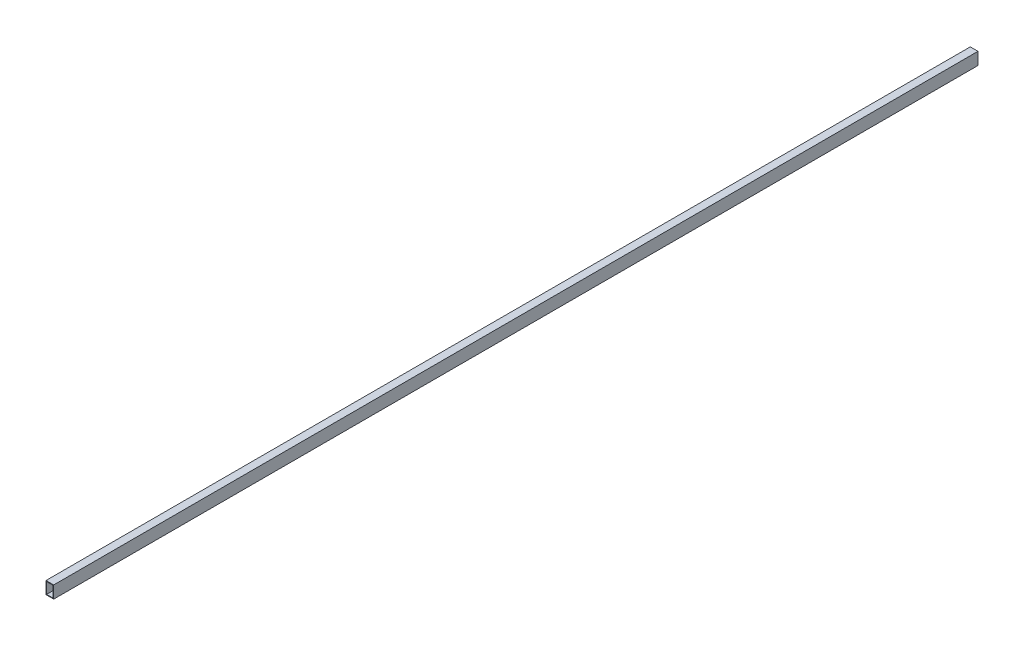
ISO-10303-21;
HEADER;
FILE_DESCRIPTION(('STEP AP214'),'2;1');
FILE_NAME('part.step','',(''),(''),'','','');
FILE_SCHEMA(('AUTOMOTIVE_DESIGN { 1 0 10303 214 1 1 1 1 }'));
ENDSEC;
DATA;
#1=APPLICATION_CONTEXT('core data for automotive mechanical design processes');
#2=APPLICATION_PROTOCOL_DEFINITION('international standard','automotive_design',2000,#1);
#3=PRODUCT_CONTEXT('',#1,'mechanical');
#4=PRODUCT('Part','Part','',(#3));
#5=PRODUCT_RELATED_PRODUCT_CATEGORY('part','',(#4));
#6=PRODUCT_DEFINITION_FORMATION('','',#4);
#7=PRODUCT_DEFINITION_CONTEXT('part definition',#1,'design');
#8=PRODUCT_DEFINITION('design','',#6,#7);
#9=PRODUCT_DEFINITION_SHAPE('','',#8);
#10=(LENGTH_UNIT() NAMED_UNIT(*) SI_UNIT(.MILLI.,.METRE.));
#11=(NAMED_UNIT(*) PLANE_ANGLE_UNIT() SI_UNIT($,.RADIAN.));
#12=(NAMED_UNIT(*) SI_UNIT($,.STERADIAN.) SOLID_ANGLE_UNIT());
#13=UNCERTAINTY_MEASURE_WITH_UNIT(LENGTH_MEASURE(1.E-05),#10,'distance_accuracy_value','');
#14=(GEOMETRIC_REPRESENTATION_CONTEXT(3) GLOBAL_UNCERTAINTY_ASSIGNED_CONTEXT((#13)) GLOBAL_UNIT_ASSIGNED_CONTEXT((#10,
#11,#12)) REPRESENTATION_CONTEXT('',''));
#15=CARTESIAN_POINT('',(0.,0.,0.));
#16=DIRECTION('',(0.,0.,1.));
#17=DIRECTION('',(1.,0.,0.));
#18=AXIS2_PLACEMENT_3D('',#15,#16,#17);
#19=CARTESIAN_POINT('',(-25.,40.,6000.));
#20=DIRECTION('',(1.,0.,0.));
#21=DIRECTION('',(0.,1.,0.));
#22=AXIS2_PLACEMENT_3D('',#19,#20,#21);
#23=PLANE('',#22);
#24=DIRECTION('',(0.,-1.,0.));
#25=VECTOR('',#24,1.);
#26=CARTESIAN_POINT('',(-25.,40.,0.));
#27=LINE('',#26,#25);
#28=CARTESIAN_POINT('',(-25.,40.,0.));
#29=VERTEX_POINT('',#28);
#30=CARTESIAN_POINT('',(-25.,-40.,0.));
#31=VERTEX_POINT('',#30);
#32=EDGE_CURVE('E147',#29,#31,#27,.T.);
#33=ORIENTED_EDGE('',*,*,#32,.T.);
#34=DIRECTION('',(0.,0.,-1.));
#35=VECTOR('',#34,1.);
#36=CARTESIAN_POINT('',(-25.,-40.,6000.));
#37=LINE('',#36,#35);
#38=CARTESIAN_POINT('',(-25.,-40.,6000.));
#39=VERTEX_POINT('',#38);
#40=EDGE_CURVE('E11',#39,#31,#37,.T.);
#41=ORIENTED_EDGE('',*,*,#40,.F.);
#42=DIRECTION('',(0.,-1.,0.));
#43=VECTOR('',#42,1.);
#44=CARTESIAN_POINT('',(-25.,40.,6000.));
#45=LINE('',#44,#43);
#46=CARTESIAN_POINT('',(-25.,40.,6000.));
#47=VERTEX_POINT('',#46);
#48=EDGE_CURVE('E153',#47,#39,#45,.T.);
#49=ORIENTED_EDGE('',*,*,#48,.F.);
#50=DIRECTION('',(0.,0.,-1.));
#51=VECTOR('',#50,1.);
#52=CARTESIAN_POINT('',(-25.,40.,6000.));
#53=LINE('',#52,#51);
#54=EDGE_CURVE('E169',#47,#29,#53,.T.);
#55=ORIENTED_EDGE('',*,*,#54,.T.);
#56=EDGE_LOOP('',(#33,#41,#49,#55));
#57=FACE_BOUND('',#56,.T.);
#58=ADVANCED_FACE('F39',(#57),#23,.F.);
#59=CARTESIAN_POINT('',(-25.,-40.,6000.));
#60=DIRECTION('',(0.,1.,0.));
#61=DIRECTION('',(0.,0.,1.));
#62=AXIS2_PLACEMENT_3D('',#59,#60,#61);
#63=PLANE('',#62);
#64=DIRECTION('',(1.,0.,0.));
#65=VECTOR('',#64,1.);
#66=CARTESIAN_POINT('',(-25.,-40.,0.));
#67=LINE('',#66,#65);
#68=CARTESIAN_POINT('',(25.,-40.,0.));
#69=VERTEX_POINT('',#68);
#70=EDGE_CURVE('E173',#31,#69,#67,.T.);
#71=ORIENTED_EDGE('',*,*,#70,.T.);
#72=DIRECTION('',(0.,0.,-1.));
#73=VECTOR('',#72,1.);
#74=CARTESIAN_POINT('',(25.,-40.,6000.));
#75=LINE('',#74,#73);
#76=CARTESIAN_POINT('',(25.,-40.,6000.));
#77=VERTEX_POINT('',#76);
#78=EDGE_CURVE('E47',#77,#69,#75,.T.);
#79=ORIENTED_EDGE('',*,*,#78,.F.);
#80=DIRECTION('',(1.,0.,0.));
#81=VECTOR('',#80,1.);
#82=CARTESIAN_POINT('',(-25.,-40.,6000.));
#83=LINE('',#82,#81);
#84=EDGE_CURVE('E157',#39,#77,#83,.T.);
#85=ORIENTED_EDGE('',*,*,#84,.F.);
#86=ORIENTED_EDGE('',*,*,#40,.T.);
#87=EDGE_LOOP('',(#71,#79,#85,#86));
#88=FACE_BOUND('',#87,.T.);
#89=ADVANCED_FACE('F195',(#88),#63,.F.);
#90=CARTESIAN_POINT('',(25.,40.,6000.));
#91=DIRECTION('',(1.,0.,0.));
#92=DIRECTION('',(0.,0.,-1.));
#93=AXIS2_PLACEMENT_3D('',#90,#91,#92);
#94=PLANE('',#93);
#95=DIRECTION('',(0.,-1.,0.));
#96=VECTOR('',#95,1.);
#97=CARTESIAN_POINT('',(25.,40.,0.));
#98=LINE('',#97,#96);
#99=CARTESIAN_POINT('',(25.,40.,0.));
#100=VERTEX_POINT('',#99);
#101=EDGE_CURVE('E177',#100,#69,#98,.T.);
#102=ORIENTED_EDGE('',*,*,#101,.F.);
#103=DIRECTION('',(0.,0.,-1.));
#104=VECTOR('',#103,1.);
#105=CARTESIAN_POINT('',(25.,40.,6000.));
#106=LINE('',#105,#104);
#107=CARTESIAN_POINT('',(25.,40.,6000.));
#108=VERTEX_POINT('',#107);
#109=EDGE_CURVE('E186',#108,#100,#106,.T.);
#110=ORIENTED_EDGE('',*,*,#109,.F.);
#111=DIRECTION('',(0.,-1.,0.));
#112=VECTOR('',#111,1.);
#113=CARTESIAN_POINT('',(25.,40.,6000.));
#114=LINE('',#113,#112);
#115=EDGE_CURVE('E161',#108,#77,#114,.T.);
#116=ORIENTED_EDGE('',*,*,#115,.T.);
#117=ORIENTED_EDGE('',*,*,#78,.T.);
#118=EDGE_LOOP('',(#102,#110,#116,#117));
#119=FACE_BOUND('',#118,.T.);
#120=ADVANCED_FACE('F192',(#119),#94,.T.);
#121=CARTESIAN_POINT('',(-25.,40.,6000.));
#122=DIRECTION('',(0.,1.,0.));
#123=DIRECTION('',(0.,0.,1.));
#124=AXIS2_PLACEMENT_3D('',#121,#122,#123);
#125=PLANE('',#124);
#126=DIRECTION('',(1.,0.,0.));
#127=VECTOR('',#126,1.);
#128=CARTESIAN_POINT('',(-25.,40.,0.));
#129=LINE('',#128,#127);
#130=EDGE_CURVE('E158',#29,#100,#129,.T.);
#131=ORIENTED_EDGE('',*,*,#130,.F.);
#132=ORIENTED_EDGE('',*,*,#54,.F.);
#133=DIRECTION('',(1.,0.,0.));
#134=VECTOR('',#133,1.);
#135=CARTESIAN_POINT('',(-25.,40.,6000.));
#136=LINE('',#135,#134);
#137=EDGE_CURVE('E165',#47,#108,#136,.T.);
#138=ORIENTED_EDGE('',*,*,#137,.T.);
#139=ORIENTED_EDGE('',*,*,#109,.T.);
#140=EDGE_LOOP('',(#131,#132,#138,#139));
#141=FACE_BOUND('',#140,.T.);
#142=ADVANCED_FACE('F202',(#141),#125,.T.);
#143=CARTESIAN_POINT('',(0.,0.,6000.));
#144=DIRECTION('',(0.,0.,1.));
#145=DIRECTION('',(1.,0.,0.));
#146=AXIS2_PLACEMENT_3D('',#143,#144,#145);
#147=PLANE('',#146);
#148=DIRECTION('',(0.,1.,0.));
#149=VECTOR('',#148,1.);
#150=CARTESIAN_POINT('',(-21.,36.,6000.));
#151=LINE('',#150,#149);
#152=CARTESIAN_POINT('',(-21.,-36.,6000.));
#153=VERTEX_POINT('',#152);
#154=CARTESIAN_POINT('',(-21.,36.,6000.));
#155=VERTEX_POINT('',#154);
#156=EDGE_CURVE('E106',#153,#155,#151,.T.);
#157=ORIENTED_EDGE('',*,*,#156,.T.);
#158=DIRECTION('',(1.,0.,0.));
#159=VECTOR('',#158,1.);
#160=CARTESIAN_POINT('',(21.,36.,6000.));
#161=LINE('',#160,#159);
#162=CARTESIAN_POINT('',(21.,36.,6000.));
#163=VERTEX_POINT('',#162);
#164=EDGE_CURVE('E116',#155,#163,#161,.T.);
#165=ORIENTED_EDGE('',*,*,#164,.T.);
#166=DIRECTION('',(0.,-1.,0.));
#167=VECTOR('',#166,1.);
#168=CARTESIAN_POINT('',(21.,36.,6000.));
#169=LINE('',#168,#167);
#170=CARTESIAN_POINT('',(21.,-36.,6000.));
#171=VERTEX_POINT('',#170);
#172=EDGE_CURVE('E54',#163,#171,#169,.T.);
#173=ORIENTED_EDGE('',*,*,#172,.T.);
#174=DIRECTION('',(-1.,0.,0.));
#175=VECTOR('',#174,1.);
#176=CARTESIAN_POINT('',(21.,-36.,6000.));
#177=LINE('',#176,#175);
#178=EDGE_CURVE('E113',#171,#153,#177,.T.);
#179=ORIENTED_EDGE('',*,*,#178,.T.);
#180=EDGE_LOOP('',(#157,#165,#173,#179));
#181=FACE_BOUND('',#180,.T.);
#182=ORIENTED_EDGE('',*,*,#48,.T.);
#183=ORIENTED_EDGE('',*,*,#84,.T.);
#184=ORIENTED_EDGE('',*,*,#115,.F.);
#185=ORIENTED_EDGE('',*,*,#137,.F.);
#186=EDGE_LOOP('',(#182,#183,#184,#185));
#187=FACE_BOUND('',#186,.T.);
#188=ADVANCED_FACE('F121',(#181,#187),#147,.T.);
#189=CARTESIAN_POINT('',(0.,0.,0.));
#190=DIRECTION('',(0.,0.,1.));
#191=DIRECTION('',(1.,0.,0.));
#192=AXIS2_PLACEMENT_3D('',#189,#190,#191);
#193=PLANE('',#192);
#194=DIRECTION('',(1.,0.,0.));
#195=VECTOR('',#194,1.);
#196=CARTESIAN_POINT('',(21.,36.,0.));
#197=LINE('',#196,#195);
#198=CARTESIAN_POINT('',(-21.,36.,0.));
#199=VERTEX_POINT('',#198);
#200=CARTESIAN_POINT('',(21.,36.,0.));
#201=VERTEX_POINT('',#200);
#202=EDGE_CURVE('E138',#199,#201,#197,.T.);
#203=ORIENTED_EDGE('',*,*,#202,.F.);
#204=DIRECTION('',(0.,1.,0.));
#205=VECTOR('',#204,1.);
#206=CARTESIAN_POINT('',(-21.,36.,0.));
#207=LINE('',#206,#205);
#208=CARTESIAN_POINT('',(-21.,-36.,0.));
#209=VERTEX_POINT('',#208);
#210=EDGE_CURVE('E62',#209,#199,#207,.T.);
#211=ORIENTED_EDGE('',*,*,#210,.F.);
#212=DIRECTION('',(-1.,0.,0.));
#213=VECTOR('',#212,1.);
#214=CARTESIAN_POINT('',(21.,-36.,0.));
#215=LINE('',#214,#213);
#216=CARTESIAN_POINT('',(21.,-36.,0.));
#217=VERTEX_POINT('',#216);
#218=EDGE_CURVE('E125',#217,#209,#215,.T.);
#219=ORIENTED_EDGE('',*,*,#218,.F.);
#220=DIRECTION('',(0.,-1.,0.));
#221=VECTOR('',#220,1.);
#222=CARTESIAN_POINT('',(21.,36.,0.));
#223=LINE('',#222,#221);
#224=EDGE_CURVE('E129',#201,#217,#223,.T.);
#225=ORIENTED_EDGE('',*,*,#224,.F.);
#226=EDGE_LOOP('',(#203,#211,#219,#225));
#227=FACE_BOUND('',#226,.T.);
#228=ORIENTED_EDGE('',*,*,#32,.F.);
#229=ORIENTED_EDGE('',*,*,#130,.T.);
#230=ORIENTED_EDGE('',*,*,#101,.T.);
#231=ORIENTED_EDGE('',*,*,#70,.F.);
#232=EDGE_LOOP('',(#228,#229,#230,#231));
#233=FACE_BOUND('',#232,.T.);
#234=ADVANCED_FACE('F199',(#227,#233),#193,.F.);
#235=CARTESIAN_POINT('',(-21.,36.,6000.));
#236=DIRECTION('',(-1.,0.,0.));
#237=DIRECTION('',(0.,-1.,0.));
#238=AXIS2_PLACEMENT_3D('',#235,#236,#237);
#239=PLANE('',#238);
#240=ORIENTED_EDGE('',*,*,#210,.T.);
#241=DIRECTION('',(0.,0.,-1.));
#242=VECTOR('',#241,1.);
#243=CARTESIAN_POINT('',(-21.,36.,6000.));
#244=LINE('',#243,#242);
#245=EDGE_CURVE('E102',#155,#199,#244,.T.);
#246=ORIENTED_EDGE('',*,*,#245,.F.);
#247=ORIENTED_EDGE('',*,*,#156,.F.);
#248=DIRECTION('',(0.,0.,-1.));
#249=VECTOR('',#248,1.);
#250=CARTESIAN_POINT('',(-21.,-36.,6000.));
#251=LINE('',#250,#249);
#252=EDGE_CURVE('E144',#153,#209,#251,.T.);
#253=ORIENTED_EDGE('',*,*,#252,.T.);
#254=EDGE_LOOP('',(#240,#246,#247,#253));
#255=FACE_BOUND('',#254,.T.);
#256=ADVANCED_FACE('F104',(#255),#239,.F.);
#257=CARTESIAN_POINT('',(21.,-36.,6000.));
#258=DIRECTION('',(0.,-1.,0.));
#259=DIRECTION('',(0.,0.,-1.));
#260=AXIS2_PLACEMENT_3D('',#257,#258,#259);
#261=PLANE('',#260);
#262=ORIENTED_EDGE('',*,*,#218,.T.);
#263=ORIENTED_EDGE('',*,*,#252,.F.);
#264=ORIENTED_EDGE('',*,*,#178,.F.);
#265=DIRECTION('',(0.,0.,-1.));
#266=VECTOR('',#265,1.);
#267=CARTESIAN_POINT('',(21.,-36.,6000.));
#268=LINE('',#267,#266);
#269=EDGE_CURVE('E148',#171,#217,#268,.T.);
#270=ORIENTED_EDGE('',*,*,#269,.T.);
#271=EDGE_LOOP('',(#262,#263,#264,#270));
#272=FACE_BOUND('',#271,.T.);
#273=ADVANCED_FACE('F224',(#272),#261,.F.);
#274=CARTESIAN_POINT('',(21.,36.,6000.));
#275=DIRECTION('',(1.,0.,0.));
#276=DIRECTION('',(0.,1.,0.));
#277=AXIS2_PLACEMENT_3D('',#274,#275,#276);
#278=PLANE('',#277);
#279=ORIENTED_EDGE('',*,*,#224,.T.);
#280=ORIENTED_EDGE('',*,*,#269,.F.);
#281=ORIENTED_EDGE('',*,*,#172,.F.);
#282=DIRECTION('',(0.,0.,-1.));
#283=VECTOR('',#282,1.);
#284=CARTESIAN_POINT('',(21.,36.,6000.));
#285=LINE('',#284,#283);
#286=EDGE_CURVE('E112',#163,#201,#285,.T.);
#287=ORIENTED_EDGE('',*,*,#286,.T.);
#288=EDGE_LOOP('',(#279,#280,#281,#287));
#289=FACE_BOUND('',#288,.T.);
#290=ADVANCED_FACE('F227',(#289),#278,.F.);
#291=CARTESIAN_POINT('',(21.,36.,6000.));
#292=DIRECTION('',(0.,1.,0.));
#293=DIRECTION('',(0.,0.,1.));
#294=AXIS2_PLACEMENT_3D('',#291,#292,#293);
#295=PLANE('',#294);
#296=ORIENTED_EDGE('',*,*,#202,.T.);
#297=ORIENTED_EDGE('',*,*,#286,.F.);
#298=ORIENTED_EDGE('',*,*,#164,.F.);
#299=ORIENTED_EDGE('',*,*,#245,.T.);
#300=EDGE_LOOP('',(#296,#297,#298,#299));
#301=FACE_BOUND('',#300,.T.);
#302=ADVANCED_FACE('F117',(#301),#295,.F.);
#303=CLOSED_SHELL('',(#58,#89,#120,#142,#188,#234,#256,#273,#290,#302));
#304=MANIFOLD_SOLID_BREP('B2',#303);
#305=ADVANCED_BREP_SHAPE_REPRESENTATION('',(#18,#304),#14);
#306=SHAPE_DEFINITION_REPRESENTATION(#9,#305);
ENDSEC;
END-ISO-10303-21;
